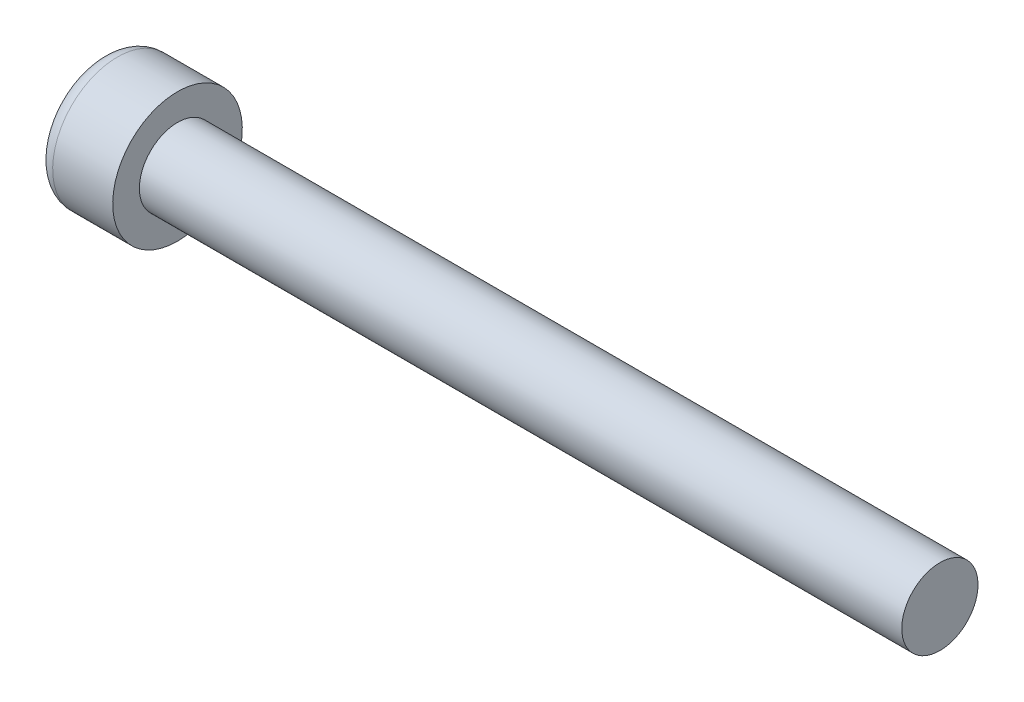
ISO-10303-21;
HEADER;
FILE_DESCRIPTION(('STEP AP214'),'2;1');
FILE_NAME('part.step','',(''),(''),'','','');
FILE_SCHEMA(('AUTOMOTIVE_DESIGN { 1 0 10303 214 1 1 1 1 }'));
ENDSEC;
DATA;
#1=APPLICATION_CONTEXT('core data for automotive mechanical design processes');
#2=APPLICATION_PROTOCOL_DEFINITION('international standard','automotive_design',2000,#1);
#3=PRODUCT_CONTEXT('',#1,'mechanical');
#4=PRODUCT('Part','Part','',(#3));
#5=PRODUCT_RELATED_PRODUCT_CATEGORY('part','',(#4));
#6=PRODUCT_DEFINITION_FORMATION('','',#4);
#7=PRODUCT_DEFINITION_CONTEXT('part definition',#1,'design');
#8=PRODUCT_DEFINITION('design','',#6,#7);
#9=PRODUCT_DEFINITION_SHAPE('','',#8);
#10=(LENGTH_UNIT() NAMED_UNIT(*) SI_UNIT(.MILLI.,.METRE.));
#11=(NAMED_UNIT(*) PLANE_ANGLE_UNIT() SI_UNIT($,.RADIAN.));
#12=(NAMED_UNIT(*) SI_UNIT($,.STERADIAN.) SOLID_ANGLE_UNIT());
#13=UNCERTAINTY_MEASURE_WITH_UNIT(LENGTH_MEASURE(1.E-05),#10,'distance_accuracy_value','');
#14=(GEOMETRIC_REPRESENTATION_CONTEXT(3) GLOBAL_UNCERTAINTY_ASSIGNED_CONTEXT((#13)) GLOBAL_UNIT_ASSIGNED_CONTEXT((#10,
#11,#12)) REPRESENTATION_CONTEXT('',''));
#15=CARTESIAN_POINT('',(0.,0.,0.));
#16=DIRECTION('',(0.,0.,1.));
#17=DIRECTION('',(1.,0.,0.));
#18=AXIS2_PLACEMENT_3D('',#15,#16,#17);
#19=CARTESIAN_POINT('',(0.,0.,0.));
#20=DIRECTION('',(1.,0.,0.));
#21=DIRECTION('',(0.,1.,0.));
#22=AXIS2_PLACEMENT_3D('',#19,#20,#21);
#23=PLANE('',#22);
#24=DIRECTION('',(0.,-0.5,-0.866025403784439));
#25=VECTOR('',#24,1.);
#26=CARTESIAN_POINT('',(0.,2.3094010767585,0.));
#27=LINE('',#26,#25);
#28=CARTESIAN_POINT('',(0.,2.3094010767585,0.));
#29=VERTEX_POINT('',#28);
#30=CARTESIAN_POINT('',(0.,1.15470053837925,-2.));
#31=VERTEX_POINT('',#30);
#32=EDGE_CURVE('E121',#29,#31,#27,.T.);
#33=ORIENTED_EDGE('',*,*,#32,.F.);
#34=DIRECTION('',(0.,0.5,-0.866025403784439));
#35=VECTOR('',#34,1.);
#36=CARTESIAN_POINT('',(0.,1.15470053837925,2.));
#37=LINE('',#36,#35);
#38=CARTESIAN_POINT('',(0.,1.15470053837925,2.));
#39=VERTEX_POINT('',#38);
#40=EDGE_CURVE('E47',#39,#29,#37,.T.);
#41=ORIENTED_EDGE('',*,*,#40,.F.);
#42=DIRECTION('',(0.,1.,0.));
#43=VECTOR('',#42,1.);
#44=CARTESIAN_POINT('',(0.,-1.15470053837925,2.));
#45=LINE('',#44,#43);
#46=CARTESIAN_POINT('',(0.,-1.15470053837925,2.));
#47=VERTEX_POINT('',#46);
#48=EDGE_CURVE('E130',#47,#39,#45,.T.);
#49=ORIENTED_EDGE('',*,*,#48,.F.);
#50=DIRECTION('',(0.,0.5,0.866025403784439));
#51=VECTOR('',#50,1.);
#52=CARTESIAN_POINT('',(0.,-2.3094010767585,0.));
#53=LINE('',#52,#51);
#54=CARTESIAN_POINT('',(0.,-2.3094010767585,0.));
#55=VERTEX_POINT('',#54);
#56=EDGE_CURVE('E128',#55,#47,#53,.T.);
#57=ORIENTED_EDGE('',*,*,#56,.F.);
#58=DIRECTION('',(0.,-0.5,0.866025403784439));
#59=VECTOR('',#58,1.);
#60=CARTESIAN_POINT('',(0.,-1.15470053837925,-2.));
#61=LINE('',#60,#59);
#62=CARTESIAN_POINT('',(0.,-1.15470053837925,-2.));
#63=VERTEX_POINT('',#62);
#64=EDGE_CURVE('E95',#63,#55,#61,.T.);
#65=ORIENTED_EDGE('',*,*,#64,.F.);
#66=DIRECTION('',(0.,-1.,0.));
#67=VECTOR('',#66,1.);
#68=CARTESIAN_POINT('',(0.,1.15470053837925,-2.));
#69=LINE('',#68,#67);
#70=EDGE_CURVE('E124',#31,#63,#69,.T.);
#71=ORIENTED_EDGE('',*,*,#70,.F.);
#72=EDGE_LOOP('',(#33,#41,#49,#57,#65,#71));
#73=FACE_BOUND('',#72,.T.);
#74=CARTESIAN_POINT('',(0.,0.,0.));
#75=DIRECTION('',(-1.,0.,0.));
#76=DIRECTION('',(0.,-1.,0.));
#77=AXIS2_PLACEMENT_3D('',#74,#75,#76);
#78=CIRCLE('',#77,3.1875);
#79=CARTESIAN_POINT('',(0.,-3.1875,0.));
#80=VERTEX_POINT('',#79);
#81=EDGE_CURVE('E11',#80,#80,#78,.T.);
#82=ORIENTED_EDGE('',*,*,#81,.T.);
#83=EDGE_LOOP('',(#82));
#84=FACE_BOUND('',#83,.T.);
#85=ADVANCED_FACE('F33',(#73,#84),#23,.F.);
#86=CARTESIAN_POINT('',(1.0625,0.,0.));
#87=DIRECTION('',(-1.,0.,0.));
#88=DIRECTION('',(0.,-1.,0.));
#89=AXIS2_PLACEMENT_3D('',#86,#87,#88);
#90=TOROIDAL_SURFACE('',#89,3.1875,1.0625);
#91=ORIENTED_EDGE('',*,*,#81,.F.);
#92=EDGE_LOOP('',(#91));
#93=FACE_BOUND('',#92,.T.);
#94=CARTESIAN_POINT('',(1.0625,0.,0.));
#95=DIRECTION('',(-1.,0.,0.));
#96=DIRECTION('',(0.,-1.,0.));
#97=AXIS2_PLACEMENT_3D('',#94,#95,#96);
#98=CIRCLE('',#97,4.25);
#99=CARTESIAN_POINT('',(1.0625,-4.25,0.));
#100=VERTEX_POINT('',#99);
#101=EDGE_CURVE('E40',#100,#100,#98,.T.);
#102=ORIENTED_EDGE('',*,*,#101,.T.);
#103=EDGE_LOOP('',(#102));
#104=FACE_BOUND('',#103,.T.);
#105=ADVANCED_FACE('F150',(#93,#104),#90,.T.);
#106=CARTESIAN_POINT('',(0.,0.,0.));
#107=DIRECTION('',(-1.,0.,0.));
#108=DIRECTION('',(0.,-1.,0.));
#109=AXIS2_PLACEMENT_3D('',#106,#107,#108);
#110=CYLINDRICAL_SURFACE('',#109,4.25);
#111=ORIENTED_EDGE('',*,*,#101,.F.);
#112=EDGE_LOOP('',(#111));
#113=FACE_BOUND('',#112,.T.);
#114=CARTESIAN_POINT('',(5.,0.,0.));
#115=DIRECTION('',(-1.,0.,0.));
#116=DIRECTION('',(0.,-1.,0.));
#117=AXIS2_PLACEMENT_3D('',#114,#115,#116);
#118=CIRCLE('',#117,4.25);
#119=CARTESIAN_POINT('',(5.,-4.25,0.));
#120=VERTEX_POINT('',#119);
#121=EDGE_CURVE('E145',#120,#120,#118,.T.);
#122=ORIENTED_EDGE('',*,*,#121,.T.);
#123=EDGE_LOOP('',(#122));
#124=FACE_BOUND('',#123,.T.);
#125=ADVANCED_FACE('F152',(#113,#124),#110,.T.);
#126=CARTESIAN_POINT('',(5.,4.25,0.));
#127=DIRECTION('',(-1.,0.,0.));
#128=DIRECTION('',(0.,-1.,0.));
#129=AXIS2_PLACEMENT_3D('',#126,#127,#128);
#130=PLANE('',#129);
#131=ORIENTED_EDGE('',*,*,#121,.F.);
#132=EDGE_LOOP('',(#131));
#133=FACE_BOUND('',#132,.T.);
#134=CARTESIAN_POINT('',(5.,0.,0.));
#135=DIRECTION('',(-1.,0.,0.));
#136=DIRECTION('',(0.,-1.,0.));
#137=AXIS2_PLACEMENT_3D('',#134,#135,#136);
#138=CIRCLE('',#137,2.5);
#139=CARTESIAN_POINT('',(5.,-2.5,0.));
#140=VERTEX_POINT('',#139);
#141=EDGE_CURVE('E142',#140,#140,#138,.T.);
#142=ORIENTED_EDGE('',*,*,#141,.T.);
#143=EDGE_LOOP('',(#142));
#144=FACE_BOUND('',#143,.T.);
#145=ADVANCED_FACE('F155',(#133,#144),#130,.F.);
#146=CARTESIAN_POINT('',(0.,0.,0.));
#147=DIRECTION('',(-1.,0.,0.));
#148=DIRECTION('',(0.,-1.,0.));
#149=AXIS2_PLACEMENT_3D('',#146,#147,#148);
#150=CYLINDRICAL_SURFACE('',#149,2.49999999999999);
#151=ORIENTED_EDGE('',*,*,#141,.F.);
#152=EDGE_LOOP('',(#151));
#153=FACE_BOUND('',#152,.T.);
#154=CARTESIAN_POINT('',(55.,0.,0.));
#155=DIRECTION('',(-1.,0.,0.));
#156=DIRECTION('',(0.,-1.,0.));
#157=AXIS2_PLACEMENT_3D('',#154,#155,#156);
#158=CIRCLE('',#157,2.49999999999999);
#159=CARTESIAN_POINT('',(55.,-2.49999999999998,0.));
#160=VERTEX_POINT('',#159);
#161=EDGE_CURVE('E134',#160,#160,#158,.T.);
#162=ORIENTED_EDGE('',*,*,#161,.T.);
#163=EDGE_LOOP('',(#162));
#164=FACE_BOUND('',#163,.T.);
#165=ADVANCED_FACE('F161',(#153,#164),#150,.T.);
#166=CARTESIAN_POINT('',(55.,2.49999999999999,0.));
#167=DIRECTION('',(-1.,0.,0.));
#168=DIRECTION('',(0.,-1.,0.));
#169=AXIS2_PLACEMENT_3D('',#166,#167,#168);
#170=PLANE('',#169);
#171=ORIENTED_EDGE('',*,*,#161,.F.);
#172=EDGE_LOOP('',(#171));
#173=FACE_BOUND('',#172,.T.);
#174=ADVANCED_FACE('F167',(#173),#170,.F.);
#175=CARTESIAN_POINT('',(2.5,1.15470053837925,2.));
#176=DIRECTION('',(0.,0.866025403784439,0.5));
#177=DIRECTION('',(0.,-0.5,0.866025403784439));
#178=AXIS2_PLACEMENT_3D('',#175,#176,#177);
#179=PLANE('',#178);
#180=ORIENTED_EDGE('',*,*,#40,.T.);
#181=DIRECTION('',(-1.,0.,0.));
#182=VECTOR('',#181,1.);
#183=CARTESIAN_POINT('',(2.5,2.3094010767585,0.));
#184=LINE('',#183,#182);
#185=CARTESIAN_POINT('',(2.5,2.3094010767585,0.));
#186=VERTEX_POINT('',#185);
#187=EDGE_CURVE('E77',#186,#29,#184,.T.);
#188=ORIENTED_EDGE('',*,*,#187,.F.);
#189=DIRECTION('',(0.,0.5,-0.866025403784439));
#190=VECTOR('',#189,1.);
#191=CARTESIAN_POINT('',(2.5,1.15470053837925,2.));
#192=LINE('',#191,#190);
#193=CARTESIAN_POINT('',(2.5,1.15470053837925,2.));
#194=VERTEX_POINT('',#193);
#195=EDGE_CURVE('E132',#194,#186,#192,.T.);
#196=ORIENTED_EDGE('',*,*,#195,.F.);
#197=DIRECTION('',(-1.,0.,0.));
#198=VECTOR('',#197,1.);
#199=CARTESIAN_POINT('',(2.5,1.15470053837925,2.));
#200=LINE('',#199,#198);
#201=EDGE_CURVE('E55',#194,#39,#200,.T.);
#202=ORIENTED_EDGE('',*,*,#201,.T.);
#203=EDGE_LOOP('',(#180,#188,#196,#202));
#204=FACE_BOUND('',#203,.T.);
#205=ADVANCED_FACE('F172',(#204),#179,.F.);
#206=CARTESIAN_POINT('',(2.5,-1.15470053837925,2.));
#207=DIRECTION('',(0.,0.,1.));
#208=DIRECTION('',(1.,0.,0.));
#209=AXIS2_PLACEMENT_3D('',#206,#207,#208);
#210=PLANE('',#209);
#211=ORIENTED_EDGE('',*,*,#48,.T.);
#212=ORIENTED_EDGE('',*,*,#201,.F.);
#213=DIRECTION('',(0.,1.,0.));
#214=VECTOR('',#213,1.);
#215=CARTESIAN_POINT('',(2.5,-1.15470053837925,2.));
#216=LINE('',#215,#214);
#217=CARTESIAN_POINT('',(2.5,-1.15470053837925,2.));
#218=VERTEX_POINT('',#217);
#219=EDGE_CURVE('E107',#218,#194,#216,.T.);
#220=ORIENTED_EDGE('',*,*,#219,.F.);
#221=DIRECTION('',(-1.,0.,0.));
#222=VECTOR('',#221,1.);
#223=CARTESIAN_POINT('',(2.5,-1.15470053837925,2.));
#224=LINE('',#223,#222);
#225=EDGE_CURVE('E99',#218,#47,#224,.T.);
#226=ORIENTED_EDGE('',*,*,#225,.T.);
#227=EDGE_LOOP('',(#211,#212,#220,#226));
#228=FACE_BOUND('',#227,.T.);
#229=ADVANCED_FACE('F177',(#228),#210,.F.);
#230=CARTESIAN_POINT('',(2.5,-2.3094010767585,0.));
#231=DIRECTION('',(0.,-0.866025403784439,0.5));
#232=DIRECTION('',(0.,-0.5,-0.866025403784439));
#233=AXIS2_PLACEMENT_3D('',#230,#231,#232);
#234=PLANE('',#233);
#235=ORIENTED_EDGE('',*,*,#56,.T.);
#236=ORIENTED_EDGE('',*,*,#225,.F.);
#237=DIRECTION('',(0.,0.5,0.866025403784439));
#238=VECTOR('',#237,1.);
#239=CARTESIAN_POINT('',(2.5,-2.3094010767585,0.));
#240=LINE('',#239,#238);
#241=CARTESIAN_POINT('',(2.5,-2.3094010767585,0.));
#242=VERTEX_POINT('',#241);
#243=EDGE_CURVE('E103',#242,#218,#240,.T.);
#244=ORIENTED_EDGE('',*,*,#243,.F.);
#245=DIRECTION('',(-1.,0.,0.));
#246=VECTOR('',#245,1.);
#247=CARTESIAN_POINT('',(2.5,-2.3094010767585,0.));
#248=LINE('',#247,#246);
#249=EDGE_CURVE('E88',#242,#55,#248,.T.);
#250=ORIENTED_EDGE('',*,*,#249,.T.);
#251=EDGE_LOOP('',(#235,#236,#244,#250));
#252=FACE_BOUND('',#251,.T.);
#253=ADVANCED_FACE('F104',(#252),#234,.F.);
#254=CARTESIAN_POINT('',(2.5,-1.15470053837925,-2.));
#255=DIRECTION('',(0.,-0.866025403784438,-0.5));
#256=DIRECTION('',(0.,0.5,-0.866025403784438));
#257=AXIS2_PLACEMENT_3D('',#254,#255,#256);
#258=PLANE('',#257);
#259=ORIENTED_EDGE('',*,*,#64,.T.);
#260=ORIENTED_EDGE('',*,*,#249,.F.);
#261=DIRECTION('',(0.,-0.5,0.866025403784439));
#262=VECTOR('',#261,1.);
#263=CARTESIAN_POINT('',(2.5,-1.15470053837925,-2.));
#264=LINE('',#263,#262);
#265=CARTESIAN_POINT('',(2.5,-1.15470053837925,-2.));
#266=VERTEX_POINT('',#265);
#267=EDGE_CURVE('E92',#266,#242,#264,.T.);
#268=ORIENTED_EDGE('',*,*,#267,.F.);
#269=DIRECTION('',(-1.,0.,0.));
#270=VECTOR('',#269,1.);
#271=CARTESIAN_POINT('',(2.5,-1.15470053837925,-2.));
#272=LINE('',#271,#270);
#273=EDGE_CURVE('E100',#266,#63,#272,.T.);
#274=ORIENTED_EDGE('',*,*,#273,.T.);
#275=EDGE_LOOP('',(#259,#260,#268,#274));
#276=FACE_BOUND('',#275,.T.);
#277=ADVANCED_FACE('F90',(#276),#258,.F.);
#278=CARTESIAN_POINT('',(2.5,1.15470053837925,-2.));
#279=DIRECTION('',(0.,0.,-1.));
#280=DIRECTION('',(-1.,0.,0.));
#281=AXIS2_PLACEMENT_3D('',#278,#279,#280);
#282=PLANE('',#281);
#283=ORIENTED_EDGE('',*,*,#70,.T.);
#284=ORIENTED_EDGE('',*,*,#273,.F.);
#285=DIRECTION('',(0.,-1.,0.));
#286=VECTOR('',#285,1.);
#287=CARTESIAN_POINT('',(2.5,1.15470053837925,-2.));
#288=LINE('',#287,#286);
#289=CARTESIAN_POINT('',(2.5,1.15470053837925,-2.));
#290=VERTEX_POINT('',#289);
#291=EDGE_CURVE('E113',#290,#266,#288,.T.);
#292=ORIENTED_EDGE('',*,*,#291,.F.);
#293=DIRECTION('',(-1.,0.,0.));
#294=VECTOR('',#293,1.);
#295=CARTESIAN_POINT('',(2.5,1.15470053837925,-2.));
#296=LINE('',#295,#294);
#297=EDGE_CURVE('E137',#290,#31,#296,.T.);
#298=ORIENTED_EDGE('',*,*,#297,.T.);
#299=EDGE_LOOP('',(#283,#284,#292,#298));
#300=FACE_BOUND('',#299,.T.);
#301=ADVANCED_FACE('F203',(#300),#282,.F.);
#302=CARTESIAN_POINT('',(2.5,2.3094010767585,0.));
#303=DIRECTION('',(0.,0.866025403784439,-0.5));
#304=DIRECTION('',(0.,0.5,0.866025403784439));
#305=AXIS2_PLACEMENT_3D('',#302,#303,#304);
#306=PLANE('',#305);
#307=ORIENTED_EDGE('',*,*,#32,.T.);
#308=ORIENTED_EDGE('',*,*,#297,.F.);
#309=DIRECTION('',(0.,-0.5,-0.866025403784439));
#310=VECTOR('',#309,1.);
#311=CARTESIAN_POINT('',(2.5,2.3094010767585,0.));
#312=LINE('',#311,#310);
#313=EDGE_CURVE('E115',#186,#290,#312,.T.);
#314=ORIENTED_EDGE('',*,*,#313,.F.);
#315=ORIENTED_EDGE('',*,*,#187,.T.);
#316=EDGE_LOOP('',(#307,#308,#314,#315));
#317=FACE_BOUND('',#316,.T.);
#318=ADVANCED_FACE('F191',(#317),#306,.F.);
#319=CARTESIAN_POINT('',(2.5,0.,0.));
#320=DIRECTION('',(-1.,0.,0.));
#321=DIRECTION('',(0.,-1.,0.));
#322=AXIS2_PLACEMENT_3D('',#319,#320,#321);
#323=PLANE('',#322);
#324=ORIENTED_EDGE('',*,*,#195,.T.);
#325=ORIENTED_EDGE('',*,*,#313,.T.);
#326=ORIENTED_EDGE('',*,*,#291,.T.);
#327=ORIENTED_EDGE('',*,*,#267,.T.);
#328=ORIENTED_EDGE('',*,*,#243,.T.);
#329=ORIENTED_EDGE('',*,*,#219,.T.);
#330=EDGE_LOOP('',(#324,#325,#326,#327,#328,#329));
#331=FACE_BOUND('',#330,.T.);
#332=ADVANCED_FACE('F110',(#331),#323,.T.);
#333=CLOSED_SHELL('',(#85,#105,#125,#145,#165,#174,#205,#229,#253,#277,#301,#318,#332));
#334=MANIFOLD_SOLID_BREP('B2',#333);
#335=ADVANCED_BREP_SHAPE_REPRESENTATION('',(#18,#334),#14);
#336=SHAPE_DEFINITION_REPRESENTATION(#9,#335);
ENDSEC;
END-ISO-10303-21;
